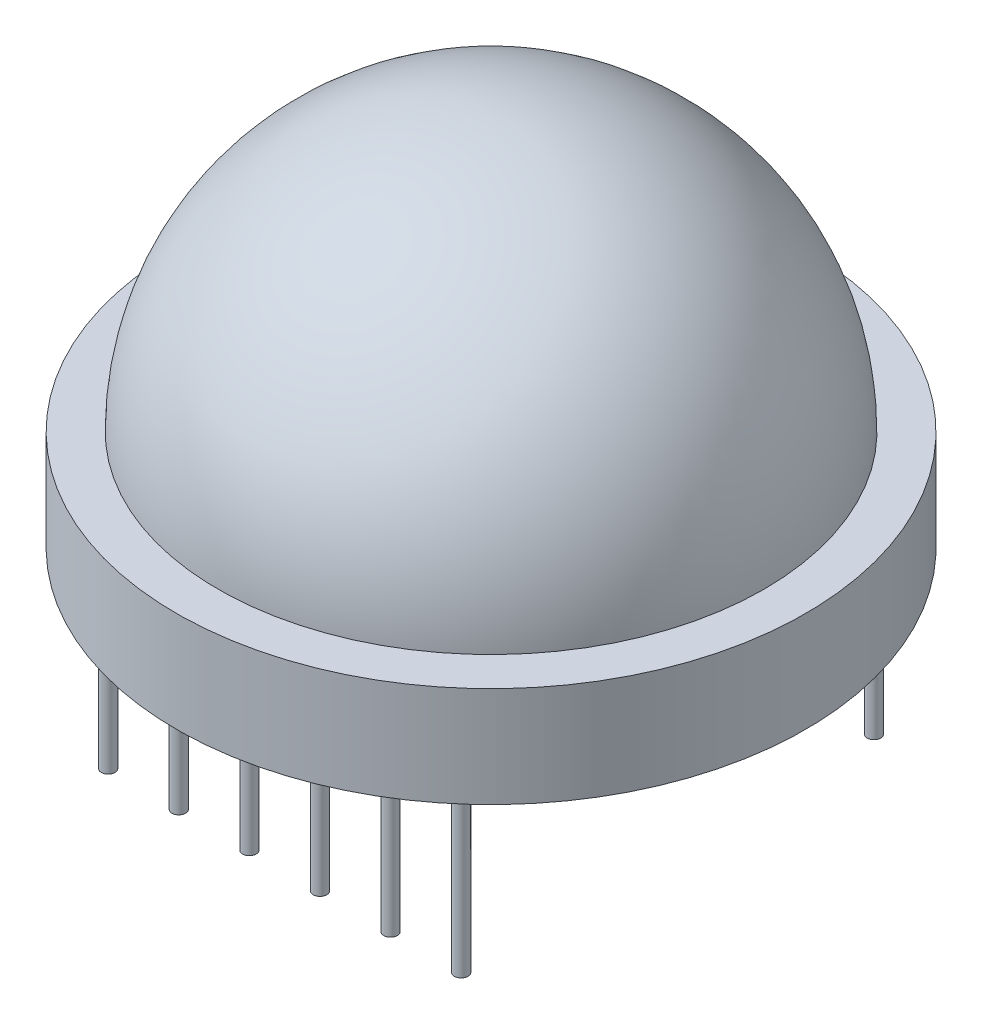
ISO-10303-21;
HEADER;
FILE_DESCRIPTION(('STEP AP214'),'2;1');
FILE_NAME('part.step','',(''),(''),'','','');
FILE_SCHEMA(('AUTOMOTIVE_DESIGN { 1 0 10303 214 1 1 1 1 }'));
ENDSEC;
DATA;
#1=APPLICATION_CONTEXT('core data for automotive mechanical design processes');
#2=APPLICATION_PROTOCOL_DEFINITION('international standard','automotive_design',2000,#1);
#3=PRODUCT_CONTEXT('',#1,'mechanical');
#4=PRODUCT('Part','Part','',(#3));
#5=PRODUCT_RELATED_PRODUCT_CATEGORY('part','',(#4));
#6=PRODUCT_DEFINITION_FORMATION('','',#4);
#7=PRODUCT_DEFINITION_CONTEXT('part definition',#1,'design');
#8=PRODUCT_DEFINITION('design','',#6,#7);
#9=PRODUCT_DEFINITION_SHAPE('','',#8);
#10=(LENGTH_UNIT() NAMED_UNIT(*) SI_UNIT(.MILLI.,.METRE.));
#11=(NAMED_UNIT(*) PLANE_ANGLE_UNIT() SI_UNIT($,.RADIAN.));
#12=(NAMED_UNIT(*) SI_UNIT($,.STERADIAN.) SOLID_ANGLE_UNIT());
#13=UNCERTAINTY_MEASURE_WITH_UNIT(LENGTH_MEASURE(1.E-05),#10,'distance_accuracy_value','');
#14=(GEOMETRIC_REPRESENTATION_CONTEXT(3) GLOBAL_UNCERTAINTY_ASSIGNED_CONTEXT((#13)) GLOBAL_UNIT_ASSIGNED_CONTEXT((#10,
#11,#12)) REPRESENTATION_CONTEXT('',''));
#15=CARTESIAN_POINT('',(0.,0.,0.));
#16=DIRECTION('',(0.,0.,1.));
#17=DIRECTION('',(1.,0.,0.));
#18=AXIS2_PLACEMENT_3D('',#15,#16,#17);
#19=CARTESIAN_POINT('',(0.,-3.69999999999993,0.));
#20=DIRECTION('',(0.,-1.,0.));
#21=DIRECTION('',(1.,0.,0.));
#22=AXIS2_PLACEMENT_3D('',#19,#20,#21);
#23=PLANE('',#22);
#24=CARTESIAN_POINT('',(-6.505,-3.69999999999993,-7.605));
#25=DIRECTION('',(0.,-1.,0.));
#26=DIRECTION('',(1.,0.,0.));
#27=AXIS2_PLACEMENT_3D('',#24,#25,#26);
#28=CIRCLE('',#27,0.249999999999998);
#29=CARTESIAN_POINT('',(-6.255,-3.69999999999993,-7.605));
#30=VERTEX_POINT('',#29);
#31=EDGE_CURVE('E115',#30,#30,#28,.T.);
#32=ORIENTED_EDGE('',*,*,#31,.F.);
#33=EDGE_LOOP('',(#32));
#34=FACE_BOUND('',#33,.T.);
#35=CARTESIAN_POINT('',(6.505,-3.69999999999993,-7.605));
#36=DIRECTION('',(0.,-1.,0.));
#37=DIRECTION('',(1.,0.,0.));
#38=AXIS2_PLACEMENT_3D('',#35,#36,#37);
#39=CIRCLE('',#38,0.249999999999998);
#40=CARTESIAN_POINT('',(6.755,-3.69999999999993,-7.605));
#41=VERTEX_POINT('',#40);
#42=EDGE_CURVE('E109',#41,#41,#39,.T.);
#43=ORIENTED_EDGE('',*,*,#42,.F.);
#44=EDGE_LOOP('',(#43));
#45=FACE_BOUND('',#44,.T.);
#46=CARTESIAN_POINT('',(3.903,-3.69999999999993,-7.605));
#47=DIRECTION('',(0.,-1.,0.));
#48=DIRECTION('',(1.,0.,0.));
#49=AXIS2_PLACEMENT_3D('',#46,#47,#48);
#50=CIRCLE('',#49,0.249999999999998);
#51=CARTESIAN_POINT('',(4.153,-3.69999999999993,-7.605));
#52=VERTEX_POINT('',#51);
#53=EDGE_CURVE('E103',#52,#52,#50,.T.);
#54=ORIENTED_EDGE('',*,*,#53,.F.);
#55=EDGE_LOOP('',(#54));
#56=FACE_BOUND('',#55,.T.);
#57=CARTESIAN_POINT('',(1.301,-3.69999999999993,-7.605));
#58=DIRECTION('',(0.,-1.,0.));
#59=DIRECTION('',(1.,0.,0.));
#60=AXIS2_PLACEMENT_3D('',#57,#58,#59);
#61=CIRCLE('',#60,0.249999999999997);
#62=CARTESIAN_POINT('',(1.551,-3.69999999999993,-7.605));
#63=VERTEX_POINT('',#62);
#64=EDGE_CURVE('E97',#63,#63,#61,.T.);
#65=ORIENTED_EDGE('',*,*,#64,.F.);
#66=EDGE_LOOP('',(#65));
#67=FACE_BOUND('',#66,.T.);
#68=CARTESIAN_POINT('',(-1.301,-3.69999999999993,-7.605));
#69=DIRECTION('',(0.,-1.,0.));
#70=DIRECTION('',(1.,0.,0.));
#71=AXIS2_PLACEMENT_3D('',#68,#69,#70);
#72=CIRCLE('',#71,0.249999999999997);
#73=CARTESIAN_POINT('',(-1.051,-3.69999999999993,-7.605));
#74=VERTEX_POINT('',#73);
#75=EDGE_CURVE('E91',#74,#74,#72,.T.);
#76=ORIENTED_EDGE('',*,*,#75,.F.);
#77=EDGE_LOOP('',(#76));
#78=FACE_BOUND('',#77,.T.);
#79=CARTESIAN_POINT('',(-3.903,-3.69999999999993,-7.605));
#80=DIRECTION('',(0.,-1.,0.));
#81=DIRECTION('',(1.,0.,0.));
#82=AXIS2_PLACEMENT_3D('',#79,#80,#81);
#83=CIRCLE('',#82,0.249999999999997);
#84=CARTESIAN_POINT('',(-3.653,-3.69999999999993,-7.605));
#85=VERTEX_POINT('',#84);
#86=EDGE_CURVE('E85',#85,#85,#83,.T.);
#87=ORIENTED_EDGE('',*,*,#86,.F.);
#88=EDGE_LOOP('',(#87));
#89=FACE_BOUND('',#88,.T.);
#90=CARTESIAN_POINT('',(6.505,-3.69999999999993,7.605));
#91=DIRECTION('',(0.,-1.,0.));
#92=DIRECTION('',(1.,0.,0.));
#93=AXIS2_PLACEMENT_3D('',#90,#91,#92);
#94=CIRCLE('',#93,0.249999999999998);
#95=CARTESIAN_POINT('',(6.755,-3.69999999999993,7.605));
#96=VERTEX_POINT('',#95);
#97=EDGE_CURVE('E79',#96,#96,#94,.T.);
#98=ORIENTED_EDGE('',*,*,#97,.F.);
#99=EDGE_LOOP('',(#98));
#100=FACE_BOUND('',#99,.T.);
#101=CARTESIAN_POINT('',(3.903,-3.69999999999993,7.605));
#102=DIRECTION('',(0.,-1.,0.));
#103=DIRECTION('',(1.,0.,0.));
#104=AXIS2_PLACEMENT_3D('',#101,#102,#103);
#105=CIRCLE('',#104,0.249999999999998);
#106=CARTESIAN_POINT('',(4.153,-3.69999999999993,7.605));
#107=VERTEX_POINT('',#106);
#108=EDGE_CURVE('E73',#107,#107,#105,.T.);
#109=ORIENTED_EDGE('',*,*,#108,.F.);
#110=EDGE_LOOP('',(#109));
#111=FACE_BOUND('',#110,.T.);
#112=CARTESIAN_POINT('',(1.301,-3.69999999999993,7.605));
#113=DIRECTION('',(0.,-1.,0.));
#114=DIRECTION('',(1.,0.,0.));
#115=AXIS2_PLACEMENT_3D('',#112,#113,#114);
#116=CIRCLE('',#115,0.249999999999998);
#117=CARTESIAN_POINT('',(1.551,-3.69999999999993,7.605));
#118=VERTEX_POINT('',#117);
#119=EDGE_CURVE('E67',#118,#118,#116,.T.);
#120=ORIENTED_EDGE('',*,*,#119,.F.);
#121=EDGE_LOOP('',(#120));
#122=FACE_BOUND('',#121,.T.);
#123=CARTESIAN_POINT('',(-1.301,-3.69999999999993,7.605));
#124=DIRECTION('',(0.,-1.,0.));
#125=DIRECTION('',(1.,0.,0.));
#126=AXIS2_PLACEMENT_3D('',#123,#124,#125);
#127=CIRCLE('',#126,0.249999999999998);
#128=CARTESIAN_POINT('',(-1.051,-3.69999999999993,7.605));
#129=VERTEX_POINT('',#128);
#130=EDGE_CURVE('E61',#129,#129,#127,.T.);
#131=ORIENTED_EDGE('',*,*,#130,.F.);
#132=EDGE_LOOP('',(#131));
#133=FACE_BOUND('',#132,.T.);
#134=CARTESIAN_POINT('',(-3.903,-3.69999999999993,7.605));
#135=DIRECTION('',(0.,-1.,0.));
#136=DIRECTION('',(1.,0.,0.));
#137=AXIS2_PLACEMENT_3D('',#134,#135,#136);
#138=CIRCLE('',#137,0.249999999999998);
#139=CARTESIAN_POINT('',(-3.653,-3.69999999999993,7.605));
#140=VERTEX_POINT('',#139);
#141=EDGE_CURVE('E55',#140,#140,#138,.T.);
#142=ORIENTED_EDGE('',*,*,#141,.F.);
#143=EDGE_LOOP('',(#142));
#144=FACE_BOUND('',#143,.T.);
#145=CARTESIAN_POINT('',(-6.505,-3.69999999999993,7.605));
#146=DIRECTION('',(0.,-1.,0.));
#147=DIRECTION('',(1.,0.,0.));
#148=AXIS2_PLACEMENT_3D('',#145,#146,#147);
#149=CIRCLE('',#148,0.249999999999998);
#150=CARTESIAN_POINT('',(-6.255,-3.69999999999993,7.605));
#151=VERTEX_POINT('',#150);
#152=EDGE_CURVE('E52',#151,#151,#149,.T.);
#153=ORIENTED_EDGE('',*,*,#152,.F.);
#154=EDGE_LOOP('',(#153));
#155=FACE_BOUND('',#154,.T.);
#156=CARTESIAN_POINT('',(0.,-3.69999999999993,0.));
#157=DIRECTION('',(0.,1.,0.));
#158=DIRECTION('',(-1.,0.,0.));
#159=AXIS2_PLACEMENT_3D('',#156,#157,#158);
#160=CIRCLE('',#159,11.595);
#161=CARTESIAN_POINT('',(-11.595,-3.69999999999993,0.));
#162=VERTEX_POINT('',#161);
#163=EDGE_CURVE('E10',#162,#162,#160,.T.);
#164=ORIENTED_EDGE('',*,*,#163,.F.);
#165=EDGE_LOOP('',(#164));
#166=FACE_BOUND('',#165,.T.);
#167=ADVANCED_FACE('F35',(#34,#45,#56,#67,#78,#89,#100,#111,#122,#133,#144,#155,#166),#23,.T.);
#168=CARTESIAN_POINT('',(0.,10.055,0.));
#169=DIRECTION('',(0.,1.,0.));
#170=DIRECTION('',(-1.,0.,0.));
#171=AXIS2_PLACEMENT_3D('',#168,#169,#170);
#172=CYLINDRICAL_SURFACE('',#171,11.595);
#173=ORIENTED_EDGE('',*,*,#163,.T.);
#174=EDGE_LOOP('',(#173));
#175=FACE_BOUND('',#174,.T.);
#176=CARTESIAN_POINT('',(0.,0.,0.));
#177=DIRECTION('',(0.,1.,0.));
#178=DIRECTION('',(-1.,0.,0.));
#179=AXIS2_PLACEMENT_3D('',#176,#177,#178);
#180=CIRCLE('',#179,11.595);
#181=CARTESIAN_POINT('',(-11.595,0.,0.));
#182=VERTEX_POINT('',#181);
#183=EDGE_CURVE('E41',#182,#182,#180,.T.);
#184=ORIENTED_EDGE('',*,*,#183,.F.);
#185=EDGE_LOOP('',(#184));
#186=FACE_BOUND('',#185,.T.);
#187=ADVANCED_FACE('F128',(#175,#186),#172,.T.);
#188=CARTESIAN_POINT('',(-11.595,0.,0.));
#189=DIRECTION('',(0.,1.,0.));
#190=DIRECTION('',(-1.,0.,0.));
#191=AXIS2_PLACEMENT_3D('',#188,#189,#190);
#192=PLANE('',#191);
#193=ORIENTED_EDGE('',*,*,#183,.T.);
#194=EDGE_LOOP('',(#193));
#195=FACE_BOUND('',#194,.T.);
#196=CARTESIAN_POINT('',(0.,0.,0.));
#197=DIRECTION('',(0.,1.,0.));
#198=DIRECTION('',(-1.,0.,0.));
#199=AXIS2_PLACEMENT_3D('',#196,#197,#198);
#200=CIRCLE('',#199,10.055);
#201=CARTESIAN_POINT('',(-10.055,0.,0.));
#202=VERTEX_POINT('',#201);
#203=EDGE_CURVE('E45',#202,#202,#200,.T.);
#204=ORIENTED_EDGE('',*,*,#203,.F.);
#205=EDGE_LOOP('',(#204));
#206=FACE_BOUND('',#205,.T.);
#207=ADVANCED_FACE('F165',(#195,#206),#192,.T.);
#208=CARTESIAN_POINT('',(0.,0.,0.));
#209=DIRECTION('',(0.,1.,0.));
#210=DIRECTION('',(1.,0.,0.));
#211=AXIS2_PLACEMENT_3D('',#208,#209,#210);
#212=SPHERICAL_SURFACE('',#211,10.055);
#213=ORIENTED_EDGE('',*,*,#203,.T.);
#214=EDGE_LOOP('',(#213));
#215=FACE_BOUND('',#214,.T.);
#216=ADVANCED_FACE('F155',(#215),#212,.T.);
#217=CARTESIAN_POINT('',(-6.505,-10.1999999999999,7.605));
#218=DIRECTION('',(0.,1.,0.));
#219=DIRECTION('',(-1.,0.,0.));
#220=AXIS2_PLACEMENT_3D('',#217,#218,#219);
#221=CYLINDRICAL_SURFACE('',#220,0.249999999999998);
#222=CARTESIAN_POINT('',(-6.505,-10.1999999999999,7.605));
#223=DIRECTION('',(0.,-1.,0.));
#224=DIRECTION('',(1.,0.,0.));
#225=AXIS2_PLACEMENT_3D('',#222,#223,#224);
#226=CIRCLE('',#225,0.249999999999998);
#227=CARTESIAN_POINT('',(-6.255,-10.1999999999999,7.605));
#228=VERTEX_POINT('',#227);
#229=EDGE_CURVE('E49',#228,#228,#226,.T.);
#230=ORIENTED_EDGE('',*,*,#229,.F.);
#231=EDGE_LOOP('',(#230));
#232=FACE_BOUND('',#231,.T.);
#233=ORIENTED_EDGE('',*,*,#152,.T.);
#234=EDGE_LOOP('',(#233));
#235=FACE_BOUND('',#234,.T.);
#236=ADVANCED_FACE('F152',(#232,#235),#221,.T.);
#237=CARTESIAN_POINT('',(-6.505,-10.1999999999999,7.605));
#238=DIRECTION('',(0.,-1.,0.));
#239=DIRECTION('',(1.,0.,0.));
#240=AXIS2_PLACEMENT_3D('',#237,#238,#239);
#241=PLANE('',#240);
#242=ORIENTED_EDGE('',*,*,#229,.T.);
#243=EDGE_LOOP('',(#242));
#244=FACE_BOUND('',#243,.T.);
#245=ADVANCED_FACE('F154',(#244),#241,.T.);
#246=CARTESIAN_POINT('',(-3.903,-10.1999999999999,7.605));
#247=DIRECTION('',(0.,1.,0.));
#248=DIRECTION('',(-1.,0.,0.));
#249=AXIS2_PLACEMENT_3D('',#246,#247,#248);
#250=CYLINDRICAL_SURFACE('',#249,0.249999999999998);
#251=CARTESIAN_POINT('',(-3.903,-10.1999999999999,7.605));
#252=DIRECTION('',(0.,-1.,0.));
#253=DIRECTION('',(1.,0.,0.));
#254=AXIS2_PLACEMENT_3D('',#251,#252,#253);
#255=CIRCLE('',#254,0.249999999999998);
#256=CARTESIAN_POINT('',(-3.653,-10.1999999999999,7.605));
#257=VERTEX_POINT('',#256);
#258=EDGE_CURVE('E58',#257,#257,#255,.T.);
#259=ORIENTED_EDGE('',*,*,#258,.F.);
#260=EDGE_LOOP('',(#259));
#261=FACE_BOUND('',#260,.T.);
#262=ORIENTED_EDGE('',*,*,#141,.T.);
#263=EDGE_LOOP('',(#262));
#264=FACE_BOUND('',#263,.T.);
#265=ADVANCED_FACE('F162',(#261,#264),#250,.T.);
#266=CARTESIAN_POINT('',(-3.903,-10.1999999999999,7.605));
#267=DIRECTION('',(0.,-1.,0.));
#268=DIRECTION('',(1.,0.,0.));
#269=AXIS2_PLACEMENT_3D('',#266,#267,#268);
#270=PLANE('',#269);
#271=ORIENTED_EDGE('',*,*,#258,.T.);
#272=EDGE_LOOP('',(#271));
#273=FACE_BOUND('',#272,.T.);
#274=ADVANCED_FACE('F213',(#273),#270,.T.);
#275=CARTESIAN_POINT('',(-1.301,-10.1999999999999,7.605));
#276=DIRECTION('',(0.,1.,0.));
#277=DIRECTION('',(-1.,0.,0.));
#278=AXIS2_PLACEMENT_3D('',#275,#276,#277);
#279=CYLINDRICAL_SURFACE('',#278,0.249999999999998);
#280=CARTESIAN_POINT('',(-1.301,-10.1999999999999,7.605));
#281=DIRECTION('',(0.,-1.,0.));
#282=DIRECTION('',(1.,0.,0.));
#283=AXIS2_PLACEMENT_3D('',#280,#281,#282);
#284=CIRCLE('',#283,0.249999999999998);
#285=CARTESIAN_POINT('',(-1.051,-10.1999999999999,7.605));
#286=VERTEX_POINT('',#285);
#287=EDGE_CURVE('E64',#286,#286,#284,.T.);
#288=ORIENTED_EDGE('',*,*,#287,.F.);
#289=EDGE_LOOP('',(#288));
#290=FACE_BOUND('',#289,.T.);
#291=ORIENTED_EDGE('',*,*,#130,.T.);
#292=EDGE_LOOP('',(#291));
#293=FACE_BOUND('',#292,.T.);
#294=ADVANCED_FACE('F224',(#290,#293),#279,.T.);
#295=CARTESIAN_POINT('',(-1.301,-10.1999999999999,7.605));
#296=DIRECTION('',(0.,-1.,0.));
#297=DIRECTION('',(1.,0.,0.));
#298=AXIS2_PLACEMENT_3D('',#295,#296,#297);
#299=PLANE('',#298);
#300=ORIENTED_EDGE('',*,*,#287,.T.);
#301=EDGE_LOOP('',(#300));
#302=FACE_BOUND('',#301,.T.);
#303=ADVANCED_FACE('F234',(#302),#299,.T.);
#304=CARTESIAN_POINT('',(1.301,-10.1999999999999,7.605));
#305=DIRECTION('',(0.,1.,0.));
#306=DIRECTION('',(-1.,0.,0.));
#307=AXIS2_PLACEMENT_3D('',#304,#305,#306);
#308=CYLINDRICAL_SURFACE('',#307,0.249999999999998);
#309=CARTESIAN_POINT('',(1.301,-10.1999999999999,7.605));
#310=DIRECTION('',(0.,-1.,0.));
#311=DIRECTION('',(1.,0.,0.));
#312=AXIS2_PLACEMENT_3D('',#309,#310,#311);
#313=CIRCLE('',#312,0.249999999999998);
#314=CARTESIAN_POINT('',(1.551,-10.1999999999999,7.605));
#315=VERTEX_POINT('',#314);
#316=EDGE_CURVE('E70',#315,#315,#313,.T.);
#317=ORIENTED_EDGE('',*,*,#316,.F.);
#318=EDGE_LOOP('',(#317));
#319=FACE_BOUND('',#318,.T.);
#320=ORIENTED_EDGE('',*,*,#119,.T.);
#321=EDGE_LOOP('',(#320));
#322=FACE_BOUND('',#321,.T.);
#323=ADVANCED_FACE('F245',(#319,#322),#308,.T.);
#324=CARTESIAN_POINT('',(1.301,-10.1999999999999,7.605));
#325=DIRECTION('',(0.,-1.,0.));
#326=DIRECTION('',(1.,0.,0.));
#327=AXIS2_PLACEMENT_3D('',#324,#325,#326);
#328=PLANE('',#327);
#329=ORIENTED_EDGE('',*,*,#316,.T.);
#330=EDGE_LOOP('',(#329));
#331=FACE_BOUND('',#330,.T.);
#332=ADVANCED_FACE('F256',(#331),#328,.T.);
#333=CARTESIAN_POINT('',(3.903,-10.1999999999999,7.605));
#334=DIRECTION('',(0.,1.,0.));
#335=DIRECTION('',(-1.,0.,0.));
#336=AXIS2_PLACEMENT_3D('',#333,#334,#335);
#337=CYLINDRICAL_SURFACE('',#336,0.249999999999998);
#338=CARTESIAN_POINT('',(3.903,-10.1999999999999,7.605));
#339=DIRECTION('',(0.,-1.,0.));
#340=DIRECTION('',(1.,0.,0.));
#341=AXIS2_PLACEMENT_3D('',#338,#339,#340);
#342=CIRCLE('',#341,0.249999999999998);
#343=CARTESIAN_POINT('',(4.153,-10.1999999999999,7.605));
#344=VERTEX_POINT('',#343);
#345=EDGE_CURVE('E76',#344,#344,#342,.T.);
#346=ORIENTED_EDGE('',*,*,#345,.F.);
#347=EDGE_LOOP('',(#346));
#348=FACE_BOUND('',#347,.T.);
#349=ORIENTED_EDGE('',*,*,#108,.T.);
#350=EDGE_LOOP('',(#349));
#351=FACE_BOUND('',#350,.T.);
#352=ADVANCED_FACE('F267',(#348,#351),#337,.T.);
#353=CARTESIAN_POINT('',(3.903,-10.1999999999999,7.605));
#354=DIRECTION('',(0.,-1.,0.));
#355=DIRECTION('',(1.,0.,0.));
#356=AXIS2_PLACEMENT_3D('',#353,#354,#355);
#357=PLANE('',#356);
#358=ORIENTED_EDGE('',*,*,#345,.T.);
#359=EDGE_LOOP('',(#358));
#360=FACE_BOUND('',#359,.T.);
#361=ADVANCED_FACE('F278',(#360),#357,.T.);
#362=CARTESIAN_POINT('',(6.505,-10.1999999999999,7.605));
#363=DIRECTION('',(0.,1.,0.));
#364=DIRECTION('',(-1.,0.,0.));
#365=AXIS2_PLACEMENT_3D('',#362,#363,#364);
#366=CYLINDRICAL_SURFACE('',#365,0.249999999999998);
#367=CARTESIAN_POINT('',(6.505,-10.1999999999999,7.605));
#368=DIRECTION('',(0.,-1.,0.));
#369=DIRECTION('',(1.,0.,0.));
#370=AXIS2_PLACEMENT_3D('',#367,#368,#369);
#371=CIRCLE('',#370,0.249999999999998);
#372=CARTESIAN_POINT('',(6.755,-10.1999999999999,7.605));
#373=VERTEX_POINT('',#372);
#374=EDGE_CURVE('E82',#373,#373,#371,.T.);
#375=ORIENTED_EDGE('',*,*,#374,.F.);
#376=EDGE_LOOP('',(#375));
#377=FACE_BOUND('',#376,.T.);
#378=ORIENTED_EDGE('',*,*,#97,.T.);
#379=EDGE_LOOP('',(#378));
#380=FACE_BOUND('',#379,.T.);
#381=ADVANCED_FACE('F289',(#377,#380),#366,.T.);
#382=CARTESIAN_POINT('',(6.505,-10.1999999999999,7.605));
#383=DIRECTION('',(0.,-1.,0.));
#384=DIRECTION('',(1.,0.,0.));
#385=AXIS2_PLACEMENT_3D('',#382,#383,#384);
#386=PLANE('',#385);
#387=ORIENTED_EDGE('',*,*,#374,.T.);
#388=EDGE_LOOP('',(#387));
#389=FACE_BOUND('',#388,.T.);
#390=ADVANCED_FACE('F300',(#389),#386,.T.);
#391=CARTESIAN_POINT('',(-3.903,-10.1999999999999,-7.605));
#392=DIRECTION('',(0.,1.,0.));
#393=DIRECTION('',(-1.,0.,0.));
#394=AXIS2_PLACEMENT_3D('',#391,#392,#393);
#395=CYLINDRICAL_SURFACE('',#394,0.249999999999997);
#396=CARTESIAN_POINT('',(-3.903,-10.1999999999999,-7.605));
#397=DIRECTION('',(0.,-1.,0.));
#398=DIRECTION('',(1.,0.,0.));
#399=AXIS2_PLACEMENT_3D('',#396,#397,#398);
#400=CIRCLE('',#399,0.249999999999997);
#401=CARTESIAN_POINT('',(-3.653,-10.1999999999999,-7.605));
#402=VERTEX_POINT('',#401);
#403=EDGE_CURVE('E88',#402,#402,#400,.T.);
#404=ORIENTED_EDGE('',*,*,#403,.F.);
#405=EDGE_LOOP('',(#404));
#406=FACE_BOUND('',#405,.T.);
#407=ORIENTED_EDGE('',*,*,#86,.T.);
#408=EDGE_LOOP('',(#407));
#409=FACE_BOUND('',#408,.T.);
#410=ADVANCED_FACE('F311',(#406,#409),#395,.T.);
#411=CARTESIAN_POINT('',(-3.903,-10.1999999999999,-7.605));
#412=DIRECTION('',(0.,-1.,0.));
#413=DIRECTION('',(1.,0.,0.));
#414=AXIS2_PLACEMENT_3D('',#411,#412,#413);
#415=PLANE('',#414);
#416=ORIENTED_EDGE('',*,*,#403,.T.);
#417=EDGE_LOOP('',(#416));
#418=FACE_BOUND('',#417,.T.);
#419=ADVANCED_FACE('F322',(#418),#415,.T.);
#420=CARTESIAN_POINT('',(-1.301,-10.1999999999999,-7.605));
#421=DIRECTION('',(0.,1.,0.));
#422=DIRECTION('',(-1.,0.,0.));
#423=AXIS2_PLACEMENT_3D('',#420,#421,#422);
#424=CYLINDRICAL_SURFACE('',#423,0.249999999999997);
#425=CARTESIAN_POINT('',(-1.301,-10.1999999999999,-7.605));
#426=DIRECTION('',(0.,-1.,0.));
#427=DIRECTION('',(1.,0.,0.));
#428=AXIS2_PLACEMENT_3D('',#425,#426,#427);
#429=CIRCLE('',#428,0.249999999999997);
#430=CARTESIAN_POINT('',(-1.051,-10.1999999999999,-7.605));
#431=VERTEX_POINT('',#430);
#432=EDGE_CURVE('E94',#431,#431,#429,.T.);
#433=ORIENTED_EDGE('',*,*,#432,.F.);
#434=EDGE_LOOP('',(#433));
#435=FACE_BOUND('',#434,.T.);
#436=ORIENTED_EDGE('',*,*,#75,.T.);
#437=EDGE_LOOP('',(#436));
#438=FACE_BOUND('',#437,.T.);
#439=ADVANCED_FACE('F333',(#435,#438),#424,.T.);
#440=CARTESIAN_POINT('',(-1.301,-10.1999999999999,-7.605));
#441=DIRECTION('',(0.,-1.,0.));
#442=DIRECTION('',(1.,0.,0.));
#443=AXIS2_PLACEMENT_3D('',#440,#441,#442);
#444=PLANE('',#443);
#445=ORIENTED_EDGE('',*,*,#432,.T.);
#446=EDGE_LOOP('',(#445));
#447=FACE_BOUND('',#446,.T.);
#448=ADVANCED_FACE('F344',(#447),#444,.T.);
#449=CARTESIAN_POINT('',(1.301,-10.1999999999999,-7.605));
#450=DIRECTION('',(0.,1.,0.));
#451=DIRECTION('',(-1.,0.,0.));
#452=AXIS2_PLACEMENT_3D('',#449,#450,#451);
#453=CYLINDRICAL_SURFACE('',#452,0.249999999999997);
#454=CARTESIAN_POINT('',(1.301,-10.1999999999999,-7.605));
#455=DIRECTION('',(0.,-1.,0.));
#456=DIRECTION('',(1.,0.,0.));
#457=AXIS2_PLACEMENT_3D('',#454,#455,#456);
#458=CIRCLE('',#457,0.249999999999997);
#459=CARTESIAN_POINT('',(1.551,-10.1999999999999,-7.605));
#460=VERTEX_POINT('',#459);
#461=EDGE_CURVE('E100',#460,#460,#458,.T.);
#462=ORIENTED_EDGE('',*,*,#461,.F.);
#463=EDGE_LOOP('',(#462));
#464=FACE_BOUND('',#463,.T.);
#465=ORIENTED_EDGE('',*,*,#64,.T.);
#466=EDGE_LOOP('',(#465));
#467=FACE_BOUND('',#466,.T.);
#468=ADVANCED_FACE('F355',(#464,#467),#453,.T.);
#469=CARTESIAN_POINT('',(1.301,-10.1999999999999,-7.605));
#470=DIRECTION('',(0.,-1.,0.));
#471=DIRECTION('',(1.,0.,0.));
#472=AXIS2_PLACEMENT_3D('',#469,#470,#471);
#473=PLANE('',#472);
#474=ORIENTED_EDGE('',*,*,#461,.T.);
#475=EDGE_LOOP('',(#474));
#476=FACE_BOUND('',#475,.T.);
#477=ADVANCED_FACE('F366',(#476),#473,.T.);
#478=CARTESIAN_POINT('',(3.903,-10.1999999999999,-7.605));
#479=DIRECTION('',(0.,1.,0.));
#480=DIRECTION('',(-1.,0.,0.));
#481=AXIS2_PLACEMENT_3D('',#478,#479,#480);
#482=CYLINDRICAL_SURFACE('',#481,0.249999999999998);
#483=CARTESIAN_POINT('',(3.903,-10.1999999999999,-7.605));
#484=DIRECTION('',(0.,-1.,0.));
#485=DIRECTION('',(1.,0.,0.));
#486=AXIS2_PLACEMENT_3D('',#483,#484,#485);
#487=CIRCLE('',#486,0.249999999999998);
#488=CARTESIAN_POINT('',(4.153,-10.1999999999999,-7.605));
#489=VERTEX_POINT('',#488);
#490=EDGE_CURVE('E106',#489,#489,#487,.T.);
#491=ORIENTED_EDGE('',*,*,#490,.F.);
#492=EDGE_LOOP('',(#491));
#493=FACE_BOUND('',#492,.T.);
#494=ORIENTED_EDGE('',*,*,#53,.T.);
#495=EDGE_LOOP('',(#494));
#496=FACE_BOUND('',#495,.T.);
#497=ADVANCED_FACE('F377',(#493,#496),#482,.T.);
#498=CARTESIAN_POINT('',(3.903,-10.1999999999999,-7.605));
#499=DIRECTION('',(0.,-1.,0.));
#500=DIRECTION('',(1.,0.,0.));
#501=AXIS2_PLACEMENT_3D('',#498,#499,#500);
#502=PLANE('',#501);
#503=ORIENTED_EDGE('',*,*,#490,.T.);
#504=EDGE_LOOP('',(#503));
#505=FACE_BOUND('',#504,.T.);
#506=ADVANCED_FACE('F388',(#505),#502,.T.);
#507=CARTESIAN_POINT('',(6.505,-10.1999999999999,-7.605));
#508=DIRECTION('',(0.,1.,0.));
#509=DIRECTION('',(-1.,0.,0.));
#510=AXIS2_PLACEMENT_3D('',#507,#508,#509);
#511=CYLINDRICAL_SURFACE('',#510,0.249999999999998);
#512=CARTESIAN_POINT('',(6.505,-10.1999999999999,-7.605));
#513=DIRECTION('',(0.,-1.,0.));
#514=DIRECTION('',(1.,0.,0.));
#515=AXIS2_PLACEMENT_3D('',#512,#513,#514);
#516=CIRCLE('',#515,0.249999999999998);
#517=CARTESIAN_POINT('',(6.755,-10.1999999999999,-7.605));
#518=VERTEX_POINT('',#517);
#519=EDGE_CURVE('E112',#518,#518,#516,.T.);
#520=ORIENTED_EDGE('',*,*,#519,.F.);
#521=EDGE_LOOP('',(#520));
#522=FACE_BOUND('',#521,.T.);
#523=ORIENTED_EDGE('',*,*,#42,.T.);
#524=EDGE_LOOP('',(#523));
#525=FACE_BOUND('',#524,.T.);
#526=ADVANCED_FACE('F399',(#522,#525),#511,.T.);
#527=CARTESIAN_POINT('',(6.505,-10.1999999999999,-7.605));
#528=DIRECTION('',(0.,-1.,0.));
#529=DIRECTION('',(1.,0.,0.));
#530=AXIS2_PLACEMENT_3D('',#527,#528,#529);
#531=PLANE('',#530);
#532=ORIENTED_EDGE('',*,*,#519,.T.);
#533=EDGE_LOOP('',(#532));
#534=FACE_BOUND('',#533,.T.);
#535=ADVANCED_FACE('F410',(#534),#531,.T.);
#536=CARTESIAN_POINT('',(-6.505,-10.1999999999999,-7.605));
#537=DIRECTION('',(0.,1.,0.));
#538=DIRECTION('',(-1.,0.,0.));
#539=AXIS2_PLACEMENT_3D('',#536,#537,#538);
#540=CYLINDRICAL_SURFACE('',#539,0.249999999999998);
#541=CARTESIAN_POINT('',(-6.505,-10.1999999999999,-7.605));
#542=DIRECTION('',(0.,-1.,0.));
#543=DIRECTION('',(1.,0.,0.));
#544=AXIS2_PLACEMENT_3D('',#541,#542,#543);
#545=CIRCLE('',#544,0.249999999999998);
#546=CARTESIAN_POINT('',(-6.255,-10.1999999999999,-7.605));
#547=VERTEX_POINT('',#546);
#548=EDGE_CURVE('E118',#547,#547,#545,.T.);
#549=ORIENTED_EDGE('',*,*,#548,.F.);
#550=EDGE_LOOP('',(#549));
#551=FACE_BOUND('',#550,.T.);
#552=ORIENTED_EDGE('',*,*,#31,.T.);
#553=EDGE_LOOP('',(#552));
#554=FACE_BOUND('',#553,.T.);
#555=ADVANCED_FACE('F124',(#551,#554),#540,.T.);
#556=CARTESIAN_POINT('',(-6.505,-10.1999999999999,-7.605));
#557=DIRECTION('',(0.,-1.,0.));
#558=DIRECTION('',(1.,0.,0.));
#559=AXIS2_PLACEMENT_3D('',#556,#557,#558);
#560=PLANE('',#559);
#561=ORIENTED_EDGE('',*,*,#548,.T.);
#562=EDGE_LOOP('',(#561));
#563=FACE_BOUND('',#562,.T.);
#564=ADVANCED_FACE('F431',(#563),#560,.T.);
#565=CLOSED_SHELL('',(#167,#187,#207,#216,#236,#245,#265,#274,#294,#303,#323,#332,#352,#361,
#381,#390,#410,#419,#439,#448,#468,#477,#497,#506,#526,#535,#555,#564));
#566=MANIFOLD_SOLID_BREP('B2',#565);
#567=ADVANCED_BREP_SHAPE_REPRESENTATION('',(#18,#566),#14);
#568=SHAPE_DEFINITION_REPRESENTATION(#9,#567);
ENDSEC;
END-ISO-10303-21;
